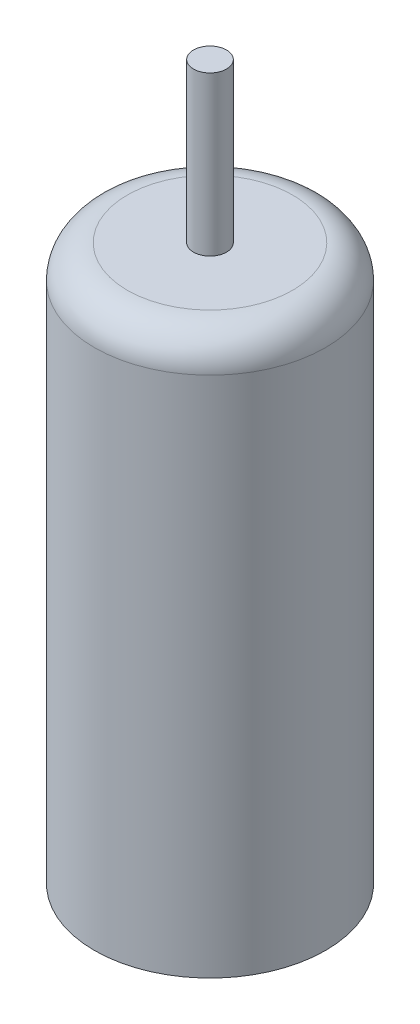
ISO-10303-21;
HEADER;
FILE_DESCRIPTION(('STEP AP214'),'2;1');
FILE_NAME('part.step','',(''),(''),'','','');
FILE_SCHEMA(('AUTOMOTIVE_DESIGN { 1 0 10303 214 1 1 1 1 }'));
ENDSEC;
DATA;
#1=APPLICATION_CONTEXT('core data for automotive mechanical design processes');
#2=APPLICATION_PROTOCOL_DEFINITION('international standard','automotive_design',2000,#1);
#3=PRODUCT_CONTEXT('',#1,'mechanical');
#4=PRODUCT('Part','Part','',(#3));
#5=PRODUCT_RELATED_PRODUCT_CATEGORY('part','',(#4));
#6=PRODUCT_DEFINITION_FORMATION('','',#4);
#7=PRODUCT_DEFINITION_CONTEXT('part definition',#1,'design');
#8=PRODUCT_DEFINITION('design','',#6,#7);
#9=PRODUCT_DEFINITION_SHAPE('','',#8);
#10=(LENGTH_UNIT() NAMED_UNIT(*) SI_UNIT(.MILLI.,.METRE.));
#11=(NAMED_UNIT(*) PLANE_ANGLE_UNIT() SI_UNIT($,.RADIAN.));
#12=(NAMED_UNIT(*) SI_UNIT($,.STERADIAN.) SOLID_ANGLE_UNIT());
#13=UNCERTAINTY_MEASURE_WITH_UNIT(LENGTH_MEASURE(1.E-05),#10,'distance_accuracy_value','');
#14=(GEOMETRIC_REPRESENTATION_CONTEXT(3) GLOBAL_UNCERTAINTY_ASSIGNED_CONTEXT((#13)) GLOBAL_UNIT_ASSIGNED_CONTEXT((#10,
#11,#12)) REPRESENTATION_CONTEXT('',''));
#15=CARTESIAN_POINT('',(0.,0.,0.));
#16=DIRECTION('',(0.,0.,1.));
#17=DIRECTION('',(1.,0.,0.));
#18=AXIS2_PLACEMENT_3D('',#15,#16,#17);
#19=CARTESIAN_POINT('',(0.,16.8,0.));
#20=DIRECTION('',(0.,-1.,0.));
#21=DIRECTION('',(0.,0.,-1.));
#22=AXIS2_PLACEMENT_3D('',#19,#20,#21);
#23=CYLINDRICAL_SURFACE('',#22,3.5);
#24=CARTESIAN_POINT('',(0.,15.8,0.));
#25=DIRECTION('',(0.,1.,0.));
#26=DIRECTION('',(0.,0.,1.));
#27=AXIS2_PLACEMENT_3D('',#24,#25,#26);
#28=CIRCLE('',#27,3.5);
#29=CARTESIAN_POINT('',(0.,15.8,3.5));
#30=VERTEX_POINT('',#29);
#31=EDGE_CURVE('E10',#30,#30,#28,.F.);
#32=ORIENTED_EDGE('',*,*,#31,.T.);
#33=EDGE_LOOP('',(#32));
#34=FACE_BOUND('',#33,.T.);
#35=CARTESIAN_POINT('',(0.,0.,0.));
#36=DIRECTION('',(0.,1.,0.));
#37=DIRECTION('',(0.,0.,1.));
#38=AXIS2_PLACEMENT_3D('',#35,#36,#37);
#39=CIRCLE('',#38,3.5);
#40=CARTESIAN_POINT('',(0.,0.,3.5));
#41=VERTEX_POINT('',#40);
#42=EDGE_CURVE('E52',#41,#41,#39,.T.);
#43=ORIENTED_EDGE('',*,*,#42,.T.);
#44=EDGE_LOOP('',(#43));
#45=FACE_BOUND('',#44,.T.);
#46=ADVANCED_FACE('F39',(#34,#45),#23,.T.);
#47=CARTESIAN_POINT('',(0.,16.8,0.));
#48=DIRECTION('',(0.,1.,0.));
#49=DIRECTION('',(0.,0.,1.));
#50=AXIS2_PLACEMENT_3D('',#47,#48,#49);
#51=PLANE('',#50);
#52=CARTESIAN_POINT('',(0.,16.8,0.));
#53=DIRECTION('',(0.,1.,0.));
#54=DIRECTION('',(0.,0.,1.));
#55=AXIS2_PLACEMENT_3D('',#52,#53,#54);
#56=CIRCLE('',#55,2.5);
#57=CARTESIAN_POINT('',(0.,16.8,2.5));
#58=VERTEX_POINT('',#57);
#59=EDGE_CURVE('E47',#58,#58,#56,.T.);
#60=ORIENTED_EDGE('',*,*,#59,.T.);
#61=EDGE_LOOP('',(#60));
#62=FACE_BOUND('',#61,.T.);
#63=CARTESIAN_POINT('',(0.,16.8,0.));
#64=DIRECTION('',(0.,1.,0.));
#65=DIRECTION('',(0.,0.,1.));
#66=AXIS2_PLACEMENT_3D('',#63,#64,#65);
#67=CIRCLE('',#66,0.5);
#68=CARTESIAN_POINT('',(0.,16.8,0.5));
#69=VERTEX_POINT('',#68);
#70=EDGE_CURVE('E60',#69,#69,#67,.T.);
#71=ORIENTED_EDGE('',*,*,#70,.F.);
#72=EDGE_LOOP('',(#71));
#73=FACE_BOUND('',#72,.T.);
#74=ADVANCED_FACE('F77',(#62,#73),#51,.T.);
#75=CARTESIAN_POINT('',(0.,0.,0.));
#76=DIRECTION('',(0.,1.,0.));
#77=DIRECTION('',(0.,0.,1.));
#78=AXIS2_PLACEMENT_3D('',#75,#76,#77);
#79=PLANE('',#78);
#80=ORIENTED_EDGE('',*,*,#42,.F.);
#81=EDGE_LOOP('',(#80));
#82=FACE_BOUND('',#81,.T.);
#83=ADVANCED_FACE('F73',(#82),#79,.F.);
#84=CARTESIAN_POINT('',(0.,21.6,0.));
#85=DIRECTION('',(0.,-1.,0.));
#86=DIRECTION('',(0.,0.,-1.));
#87=AXIS2_PLACEMENT_3D('',#84,#85,#86);
#88=CYLINDRICAL_SURFACE('',#87,0.5);
#89=CARTESIAN_POINT('',(0.,21.6,0.));
#90=DIRECTION('',(0.,1.,0.));
#91=DIRECTION('',(0.,0.,1.));
#92=AXIS2_PLACEMENT_3D('',#89,#90,#91);
#93=CIRCLE('',#92,0.5);
#94=CARTESIAN_POINT('',(0.,21.6,0.5));
#95=VERTEX_POINT('',#94);
#96=EDGE_CURVE('E57',#95,#95,#93,.T.);
#97=ORIENTED_EDGE('',*,*,#96,.F.);
#98=EDGE_LOOP('',(#97));
#99=FACE_BOUND('',#98,.T.);
#100=ORIENTED_EDGE('',*,*,#70,.T.);
#101=EDGE_LOOP('',(#100));
#102=FACE_BOUND('',#101,.T.);
#103=ADVANCED_FACE('F70',(#99,#102),#88,.T.);
#104=CARTESIAN_POINT('',(0.,21.6,0.));
#105=DIRECTION('',(0.,1.,0.));
#106=DIRECTION('',(0.,0.,1.));
#107=AXIS2_PLACEMENT_3D('',#104,#105,#106);
#108=PLANE('',#107);
#109=ORIENTED_EDGE('',*,*,#96,.T.);
#110=EDGE_LOOP('',(#109));
#111=FACE_BOUND('',#110,.T.);
#112=ADVANCED_FACE('F68',(#111),#108,.T.);
#113=CARTESIAN_POINT('',(0.,15.8,0.));
#114=DIRECTION('',(0.,1.,0.));
#115=DIRECTION('',(0.,0.,1.));
#116=AXIS2_PLACEMENT_3D('',#113,#114,#115);
#117=TOROIDAL_SURFACE('',#116,2.5,1.);
#118=ORIENTED_EDGE('',*,*,#31,.F.);
#119=EDGE_LOOP('',(#118));
#120=FACE_BOUND('',#119,.T.);
#121=ORIENTED_EDGE('',*,*,#59,.F.);
#122=EDGE_LOOP('',(#121));
#123=FACE_BOUND('',#122,.T.);
#124=ADVANCED_FACE('F41',(#120,#123),#117,.T.);
#125=CLOSED_SHELL('',(#46,#74,#83,#103,#112,#124));
#126=MANIFOLD_SOLID_BREP('B2',#125);
#127=ADVANCED_BREP_SHAPE_REPRESENTATION('',(#18,#126),#14);
#128=SHAPE_DEFINITION_REPRESENTATION(#9,#127);
ENDSEC;
END-ISO-10303-21;
